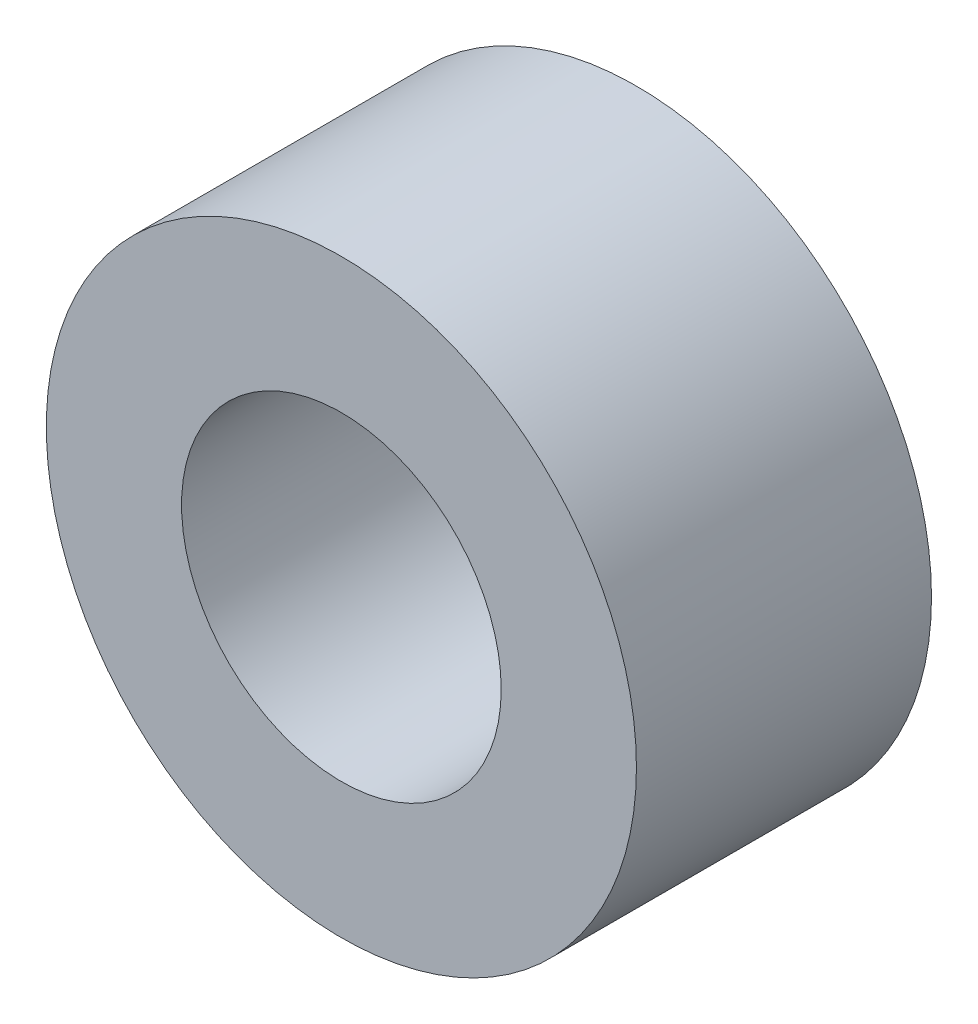
ISO-10303-21;
HEADER;
FILE_DESCRIPTION(('STEP AP214'),'2;1');
FILE_NAME('part.step','',(''),(''),'','','');
FILE_SCHEMA(('AUTOMOTIVE_DESIGN { 1 0 10303 214 1 1 1 1 }'));
ENDSEC;
DATA;
#1=APPLICATION_CONTEXT('core data for automotive mechanical design processes');
#2=APPLICATION_PROTOCOL_DEFINITION('international standard','automotive_design',2000,#1);
#3=PRODUCT_CONTEXT('',#1,'mechanical');
#4=PRODUCT('Part','Part','',(#3));
#5=PRODUCT_RELATED_PRODUCT_CATEGORY('part','',(#4));
#6=PRODUCT_DEFINITION_FORMATION('','',#4);
#7=PRODUCT_DEFINITION_CONTEXT('part definition',#1,'design');
#8=PRODUCT_DEFINITION('design','',#6,#7);
#9=PRODUCT_DEFINITION_SHAPE('','',#8);
#10=(LENGTH_UNIT() NAMED_UNIT(*) SI_UNIT(.MILLI.,.METRE.));
#11=(NAMED_UNIT(*) PLANE_ANGLE_UNIT() SI_UNIT($,.RADIAN.));
#12=(NAMED_UNIT(*) SI_UNIT($,.STERADIAN.) SOLID_ANGLE_UNIT());
#13=UNCERTAINTY_MEASURE_WITH_UNIT(LENGTH_MEASURE(1.E-05),#10,'distance_accuracy_value','');
#14=(GEOMETRIC_REPRESENTATION_CONTEXT(3) GLOBAL_UNCERTAINTY_ASSIGNED_CONTEXT((#13)) GLOBAL_UNIT_ASSIGNED_CONTEXT((#10,
#11,#12)) REPRESENTATION_CONTEXT('',''));
#15=CARTESIAN_POINT('',(0.,0.,0.));
#16=DIRECTION('',(0.,0.,1.));
#17=DIRECTION('',(1.,0.,0.));
#18=AXIS2_PLACEMENT_3D('',#15,#16,#17);
#19=CARTESIAN_POINT('',(0.,0.,6.));
#20=DIRECTION('',(0.,0.,1.));
#21=DIRECTION('',(1.,0.,0.));
#22=AXIS2_PLACEMENT_3D('',#19,#20,#21);
#23=PLANE('',#22);
#24=CARTESIAN_POINT('',(0.,0.,6.));
#25=DIRECTION('',(0.,0.,1.));
#26=DIRECTION('',(1.,0.,0.));
#27=AXIS2_PLACEMENT_3D('',#24,#25,#26);
#28=CIRCLE('',#27,6.);
#29=CARTESIAN_POINT('',(6.,0.,6.));
#30=VERTEX_POINT('',#29);
#31=EDGE_CURVE('E10',#30,#30,#28,.T.);
#32=ORIENTED_EDGE('',*,*,#31,.T.);
#33=EDGE_LOOP('',(#32));
#34=FACE_BOUND('',#33,.T.);
#35=CARTESIAN_POINT('',(0.,0.,6.));
#36=DIRECTION('',(0.,0.,1.));
#37=DIRECTION('',(1.,0.,0.));
#38=AXIS2_PLACEMENT_3D('',#35,#36,#37);
#39=CIRCLE('',#38,3.25);
#40=CARTESIAN_POINT('',(3.25,0.,6.));
#41=VERTEX_POINT('',#40);
#42=EDGE_CURVE('E45',#41,#41,#39,.T.);
#43=ORIENTED_EDGE('',*,*,#42,.F.);
#44=EDGE_LOOP('',(#43));
#45=FACE_BOUND('',#44,.T.);
#46=ADVANCED_FACE('F34',(#34,#45),#23,.T.);
#47=CARTESIAN_POINT('',(0.,0.,0.));
#48=DIRECTION('',(0.,0.,1.));
#49=DIRECTION('',(1.,0.,0.));
#50=AXIS2_PLACEMENT_3D('',#47,#48,#49);
#51=PLANE('',#50);
#52=CARTESIAN_POINT('',(0.,0.,0.));
#53=DIRECTION('',(0.,0.,1.));
#54=DIRECTION('',(1.,0.,0.));
#55=AXIS2_PLACEMENT_3D('',#52,#53,#54);
#56=CIRCLE('',#55,6.);
#57=CARTESIAN_POINT('',(6.,0.,0.));
#58=VERTEX_POINT('',#57);
#59=EDGE_CURVE('E38',#58,#58,#56,.T.);
#60=ORIENTED_EDGE('',*,*,#59,.F.);
#61=EDGE_LOOP('',(#60));
#62=FACE_BOUND('',#61,.T.);
#63=CARTESIAN_POINT('',(0.,0.,0.));
#64=DIRECTION('',(0.,0.,1.));
#65=DIRECTION('',(1.,0.,0.));
#66=AXIS2_PLACEMENT_3D('',#63,#64,#65);
#67=CIRCLE('',#66,3.25);
#68=CARTESIAN_POINT('',(3.25,0.,0.));
#69=VERTEX_POINT('',#68);
#70=EDGE_CURVE('E47',#69,#69,#67,.T.);
#71=ORIENTED_EDGE('',*,*,#70,.T.);
#72=EDGE_LOOP('',(#71));
#73=FACE_BOUND('',#72,.T.);
#74=ADVANCED_FACE('F57',(#62,#73),#51,.F.);
#75=CARTESIAN_POINT('',(0.,0.,6.));
#76=DIRECTION('',(0.,0.,-1.));
#77=DIRECTION('',(-1.,0.,0.));
#78=AXIS2_PLACEMENT_3D('',#75,#76,#77);
#79=CYLINDRICAL_SURFACE('',#78,6.);
#80=ORIENTED_EDGE('',*,*,#31,.F.);
#81=EDGE_LOOP('',(#80));
#82=FACE_BOUND('',#81,.T.);
#83=ORIENTED_EDGE('',*,*,#59,.T.);
#84=EDGE_LOOP('',(#83));
#85=FACE_BOUND('',#84,.T.);
#86=ADVANCED_FACE('F36',(#82,#85),#79,.T.);
#87=CARTESIAN_POINT('',(0.,0.,6.));
#88=DIRECTION('',(0.,0.,-1.));
#89=DIRECTION('',(-1.,0.,0.));
#90=AXIS2_PLACEMENT_3D('',#87,#88,#89);
#91=CYLINDRICAL_SURFACE('',#90,3.25);
#92=ORIENTED_EDGE('',*,*,#42,.T.);
#93=EDGE_LOOP('',(#92));
#94=FACE_BOUND('',#93,.T.);
#95=ORIENTED_EDGE('',*,*,#70,.F.);
#96=EDGE_LOOP('',(#95));
#97=FACE_BOUND('',#96,.T.);
#98=ADVANCED_FACE('F53',(#94,#97),#91,.F.);
#99=CLOSED_SHELL('',(#46,#74,#86,#98));
#100=MANIFOLD_SOLID_BREP('B2',#99);
#101=ADVANCED_BREP_SHAPE_REPRESENTATION('',(#18,#100),#14);
#102=SHAPE_DEFINITION_REPRESENTATION(#9,#101);
ENDSEC;
END-ISO-10303-21;
